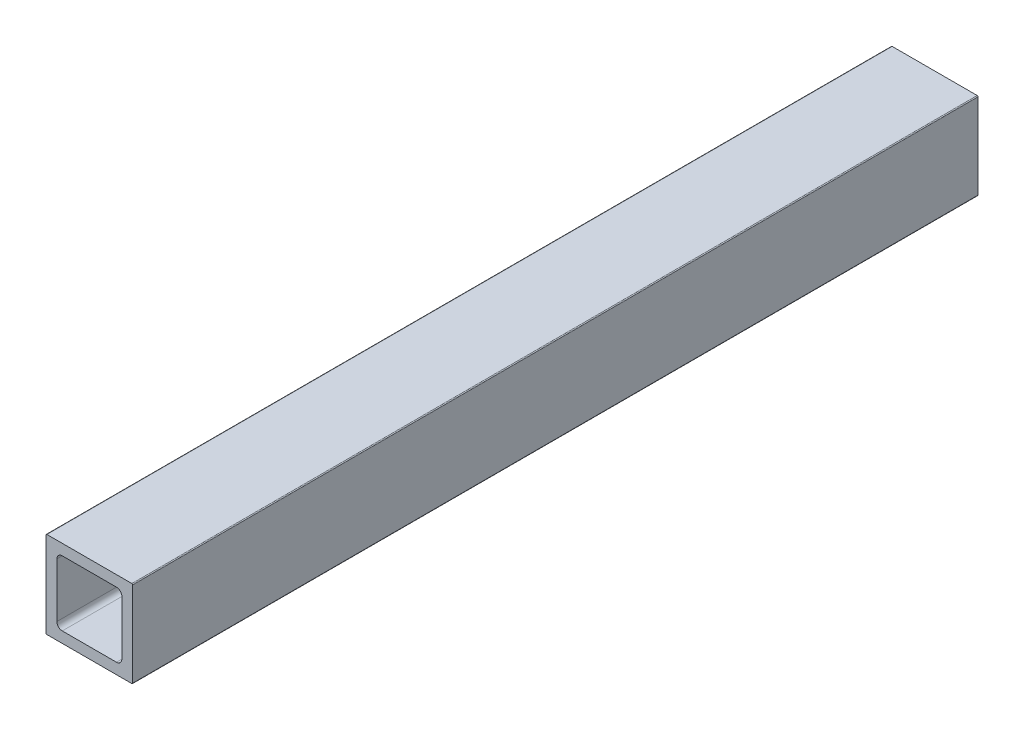
ISO-10303-21;
HEADER;
FILE_DESCRIPTION(('STEP AP214'),'2;1');
FILE_NAME('part.step','',(''),(''),'','','');
FILE_SCHEMA(('AUTOMOTIVE_DESIGN { 1 0 10303 214 1 1 1 1 }'));
ENDSEC;
DATA;
#1=APPLICATION_CONTEXT('core data for automotive mechanical design processes');
#2=APPLICATION_PROTOCOL_DEFINITION('international standard','automotive_design',2000,#1);
#3=PRODUCT_CONTEXT('',#1,'mechanical');
#4=PRODUCT('Part','Part','',(#3));
#5=PRODUCT_RELATED_PRODUCT_CATEGORY('part','',(#4));
#6=PRODUCT_DEFINITION_FORMATION('','',#4);
#7=PRODUCT_DEFINITION_CONTEXT('part definition',#1,'design');
#8=PRODUCT_DEFINITION('design','',#6,#7);
#9=PRODUCT_DEFINITION_SHAPE('','',#8);
#10=(LENGTH_UNIT() NAMED_UNIT(*) SI_UNIT(.MILLI.,.METRE.));
#11=(NAMED_UNIT(*) PLANE_ANGLE_UNIT() SI_UNIT($,.RADIAN.));
#12=(NAMED_UNIT(*) SI_UNIT($,.STERADIAN.) SOLID_ANGLE_UNIT());
#13=UNCERTAINTY_MEASURE_WITH_UNIT(LENGTH_MEASURE(1.E-05),#10,'distance_accuracy_value','');
#14=(GEOMETRIC_REPRESENTATION_CONTEXT(3) GLOBAL_UNCERTAINTY_ASSIGNED_CONTEXT((#13)) GLOBAL_UNIT_ASSIGNED_CONTEXT((#10,
#11,#12)) REPRESENTATION_CONTEXT('',''));
#15=CARTESIAN_POINT('',(0.,0.,0.));
#16=DIRECTION('',(0.,0.,1.));
#17=DIRECTION('',(1.,0.,0.));
#18=AXIS2_PLACEMENT_3D('',#15,#16,#17);
#19=CARTESIAN_POINT('',(0.254,0.254,0.));
#20=DIRECTION('',(0.,0.,-1.));
#21=DIRECTION('',(0.,-1.,0.));
#22=AXIS2_PLACEMENT_3D('',#19,#20,#21);
#23=PLANE('',#22);
#24=CARTESIAN_POINT('',(0.254,0.254,0.));
#25=DIRECTION('',(0.,0.,1.));
#26=DIRECTION('',(-1.,0.,0.));
#27=AXIS2_PLACEMENT_3D('',#24,#25,#26);
#28=CIRCLE('',#27,0.254);
#29=CARTESIAN_POINT('',(0.,0.254,0.));
#30=VERTEX_POINT('',#29);
#31=CARTESIAN_POINT('',(0.254,0.,0.));
#32=VERTEX_POINT('',#31);
#33=EDGE_CURVE('E204',#30,#32,#28,.T.);
#34=ORIENTED_EDGE('',*,*,#33,.F.);
#35=DIRECTION('',(0.,-1.,0.));
#36=VECTOR('',#35,1.);
#37=CARTESIAN_POINT('',(0.,0.254,0.));
#38=LINE('',#37,#36);
#39=CARTESIAN_POINT('',(0.,25.146,0.));
#40=VERTEX_POINT('',#39);
#41=EDGE_CURVE('E201',#40,#30,#38,.T.);
#42=ORIENTED_EDGE('',*,*,#41,.F.);
#43=CARTESIAN_POINT('',(0.254,25.146,0.));
#44=DIRECTION('',(0.,0.,1.));
#45=DIRECTION('',(-1.,0.,0.));
#46=AXIS2_PLACEMENT_3D('',#43,#44,#45);
#47=CIRCLE('',#46,0.254);
#48=CARTESIAN_POINT('',(0.254,25.4,0.));
#49=VERTEX_POINT('',#48);
#50=EDGE_CURVE('E226',#49,#40,#47,.T.);
#51=ORIENTED_EDGE('',*,*,#50,.F.);
#52=DIRECTION('',(-1.,0.,0.));
#53=VECTOR('',#52,1.);
#54=CARTESIAN_POINT('',(0.254,25.4,0.));
#55=LINE('',#54,#53);
#56=CARTESIAN_POINT('',(25.146,25.4,0.));
#57=VERTEX_POINT('',#56);
#58=EDGE_CURVE('E216',#57,#49,#55,.T.);
#59=ORIENTED_EDGE('',*,*,#58,.F.);
#60=CARTESIAN_POINT('',(25.146,25.146,0.));
#61=DIRECTION('',(0.,0.,1.));
#62=DIRECTION('',(-1.,0.,0.));
#63=AXIS2_PLACEMENT_3D('',#60,#61,#62);
#64=CIRCLE('',#63,0.254);
#65=CARTESIAN_POINT('',(25.4,25.146,0.));
#66=VERTEX_POINT('',#65);
#67=EDGE_CURVE('E252',#66,#57,#64,.T.);
#68=ORIENTED_EDGE('',*,*,#67,.F.);
#69=DIRECTION('',(0.,1.,0.));
#70=VECTOR('',#69,1.);
#71=CARTESIAN_POINT('',(25.4,0.254,0.));
#72=LINE('',#71,#70);
#73=CARTESIAN_POINT('',(25.4,0.254,0.));
#74=VERTEX_POINT('',#73);
#75=EDGE_CURVE('E251',#74,#66,#72,.T.);
#76=ORIENTED_EDGE('',*,*,#75,.F.);
#77=CARTESIAN_POINT('',(25.146,0.254,0.));
#78=DIRECTION('',(0.,0.,1.));
#79=DIRECTION('',(1.,0.,0.));
#80=AXIS2_PLACEMENT_3D('',#77,#78,#79);
#81=CIRCLE('',#80,0.254);
#82=CARTESIAN_POINT('',(25.146,0.,0.));
#83=VERTEX_POINT('',#82);
#84=EDGE_CURVE('E218',#83,#74,#81,.T.);
#85=ORIENTED_EDGE('',*,*,#84,.F.);
#86=DIRECTION('',(1.,0.,0.));
#87=VECTOR('',#86,1.);
#88=CARTESIAN_POINT('',(0.254,0.,0.));
#89=LINE('',#88,#87);
#90=EDGE_CURVE('E205',#32,#83,#89,.T.);
#91=ORIENTED_EDGE('',*,*,#90,.F.);
#92=EDGE_LOOP('',(#34,#42,#51,#59,#68,#76,#85,#91));
#93=FACE_BOUND('',#92,.T.);
#94=DIRECTION('',(0.,-1.,0.));
#95=VECTOR('',#94,1.);
#96=CARTESIAN_POINT('',(3.175,4.7625,0.));
#97=LINE('',#96,#95);
#98=CARTESIAN_POINT('',(3.175,20.6375,0.));
#99=VERTEX_POINT('',#98);
#100=CARTESIAN_POINT('',(3.175,4.7625,0.));
#101=VERTEX_POINT('',#100);
#102=EDGE_CURVE('E60',#99,#101,#97,.T.);
#103=ORIENTED_EDGE('',*,*,#102,.T.);
#104=CARTESIAN_POINT('',(4.7625,4.7625,0.));
#105=DIRECTION('',(0.,0.,1.));
#106=DIRECTION('',(1.,0.,0.));
#107=AXIS2_PLACEMENT_3D('',#104,#105,#106);
#108=CIRCLE('',#107,1.5875);
#109=CARTESIAN_POINT('',(4.7625,3.175,0.));
#110=VERTEX_POINT('',#109);
#111=EDGE_CURVE('E290',#101,#110,#108,.T.);
#112=ORIENTED_EDGE('',*,*,#111,.T.);
#113=DIRECTION('',(1.,0.,0.));
#114=VECTOR('',#113,1.);
#115=CARTESIAN_POINT('',(4.7625,3.175,0.));
#116=LINE('',#115,#114);
#117=CARTESIAN_POINT('',(20.6375,3.175,0.));
#118=VERTEX_POINT('',#117);
#119=EDGE_CURVE('E269',#110,#118,#116,.T.);
#120=ORIENTED_EDGE('',*,*,#119,.T.);
#121=CARTESIAN_POINT('',(20.6375,4.7625,0.));
#122=DIRECTION('',(0.,0.,1.));
#123=DIRECTION('',(-1.,0.,0.));
#124=AXIS2_PLACEMENT_3D('',#121,#122,#123);
#125=CIRCLE('',#124,1.5875);
#126=CARTESIAN_POINT('',(22.225,4.7625,0.));
#127=VERTEX_POINT('',#126);
#128=EDGE_CURVE('E238',#118,#127,#125,.T.);
#129=ORIENTED_EDGE('',*,*,#128,.T.);
#130=DIRECTION('',(0.,1.,0.));
#131=VECTOR('',#130,1.);
#132=CARTESIAN_POINT('',(22.225,4.7625,0.));
#133=LINE('',#132,#131);
#134=CARTESIAN_POINT('',(22.225,20.6375,0.));
#135=VERTEX_POINT('',#134);
#136=EDGE_CURVE('E234',#127,#135,#133,.T.);
#137=ORIENTED_EDGE('',*,*,#136,.T.);
#138=CARTESIAN_POINT('',(20.6375,20.6375,0.));
#139=DIRECTION('',(0.,0.,1.));
#140=DIRECTION('',(-1.,0.,0.));
#141=AXIS2_PLACEMENT_3D('',#138,#139,#140);
#142=CIRCLE('',#141,1.5875);
#143=CARTESIAN_POINT('',(20.6375,22.225,0.));
#144=VERTEX_POINT('',#143);
#145=EDGE_CURVE('E239',#135,#144,#142,.T.);
#146=ORIENTED_EDGE('',*,*,#145,.T.);
#147=DIRECTION('',(-1.,0.,0.));
#148=VECTOR('',#147,1.);
#149=CARTESIAN_POINT('',(4.7625,22.225,0.));
#150=LINE('',#149,#148);
#151=CARTESIAN_POINT('',(4.7625,22.225,0.));
#152=VERTEX_POINT('',#151);
#153=EDGE_CURVE('E244',#144,#152,#150,.T.);
#154=ORIENTED_EDGE('',*,*,#153,.T.);
#155=CARTESIAN_POINT('',(4.7625,20.6375,0.));
#156=DIRECTION('',(0.,0.,1.));
#157=DIRECTION('',(-1.,0.,0.));
#158=AXIS2_PLACEMENT_3D('',#155,#156,#157);
#159=CIRCLE('',#158,1.5875);
#160=EDGE_CURVE('E210',#152,#99,#159,.T.);
#161=ORIENTED_EDGE('',*,*,#160,.T.);
#162=EDGE_LOOP('',(#103,#112,#120,#129,#137,#146,#154,#161));
#163=FACE_BOUND('',#162,.T.);
#164=ADVANCED_FACE('F51',(#93,#163),#23,.T.);
#165=CARTESIAN_POINT('',(0.254,0.254,1828.8));
#166=DIRECTION('',(0.,0.,-1.));
#167=DIRECTION('',(-1.,0.,0.));
#168=AXIS2_PLACEMENT_3D('',#165,#166,#167);
#169=CYLINDRICAL_SURFACE('',#168,0.254);
#170=CARTESIAN_POINT('',(0.254,0.254,247.65));
#171=DIRECTION('',(0.,0.,-1.));
#172=DIRECTION('',(-1.,0.,0.));
#173=AXIS2_PLACEMENT_3D('',#170,#171,#172);
#174=CIRCLE('',#173,0.254);
#175=CARTESIAN_POINT('',(0.,0.254,247.65));
#176=VERTEX_POINT('',#175);
#177=CARTESIAN_POINT('',(0.254,0.,247.65));
#178=VERTEX_POINT('',#177);
#179=EDGE_CURVE('E180',#176,#178,#174,.F.);
#180=ORIENTED_EDGE('',*,*,#179,.F.);
#181=DIRECTION('',(0.,0.,-1.));
#182=VECTOR('',#181,1.);
#183=CARTESIAN_POINT('',(0.,0.254,1828.8));
#184=LINE('',#183,#182);
#185=EDGE_CURVE('E192',#176,#30,#184,.T.);
#186=ORIENTED_EDGE('',*,*,#185,.T.);
#187=ORIENTED_EDGE('',*,*,#33,.T.);
#188=DIRECTION('',(0.,0.,-1.));
#189=VECTOR('',#188,1.);
#190=CARTESIAN_POINT('',(0.254,0.,1828.8));
#191=LINE('',#190,#189);
#192=EDGE_CURVE('E194',#178,#32,#191,.T.);
#193=ORIENTED_EDGE('',*,*,#192,.F.);
#194=EDGE_LOOP('',(#180,#186,#187,#193));
#195=FACE_BOUND('',#194,.T.);
#196=ADVANCED_FACE('F190',(#195),#169,.T.);
#197=CARTESIAN_POINT('',(0.254,0.,1828.8));
#198=DIRECTION('',(0.,1.,0.));
#199=DIRECTION('',(1.,0.,0.));
#200=AXIS2_PLACEMENT_3D('',#197,#198,#199);
#201=PLANE('',#200);
#202=DIRECTION('',(0.,0.,-1.));
#203=VECTOR('',#202,1.);
#204=CARTESIAN_POINT('',(25.146,0.,1828.8));
#205=LINE('',#204,#203);
#206=CARTESIAN_POINT('',(25.146,0.,247.65));
#207=VERTEX_POINT('',#206);
#208=EDGE_CURVE('E222',#207,#83,#205,.T.);
#209=ORIENTED_EDGE('',*,*,#208,.F.);
#210=DIRECTION('',(1.,0.,0.));
#211=VECTOR('',#210,1.);
#212=CARTESIAN_POINT('',(0.,0.,247.65));
#213=LINE('',#212,#211);
#214=EDGE_CURVE('E186',#178,#207,#213,.T.);
#215=ORIENTED_EDGE('',*,*,#214,.F.);
#216=ORIENTED_EDGE('',*,*,#192,.T.);
#217=ORIENTED_EDGE('',*,*,#90,.T.);
#218=EDGE_LOOP('',(#209,#215,#216,#217));
#219=FACE_BOUND('',#218,.T.);
#220=ADVANCED_FACE('F406',(#219),#201,.F.);
#221=CARTESIAN_POINT('',(25.146,0.254,1828.8));
#222=DIRECTION('',(0.,0.,-1.));
#223=DIRECTION('',(-1.,0.,0.));
#224=AXIS2_PLACEMENT_3D('',#221,#222,#223);
#225=CYLINDRICAL_SURFACE('',#224,0.254);
#226=CARTESIAN_POINT('',(25.146,0.254,247.65));
#227=DIRECTION('',(0.,0.,-1.));
#228=DIRECTION('',(-1.,0.,0.));
#229=AXIS2_PLACEMENT_3D('',#226,#227,#228);
#230=CIRCLE('',#229,0.254);
#231=CARTESIAN_POINT('',(25.4,0.254,247.65));
#232=VERTEX_POINT('',#231);
#233=EDGE_CURVE('E197',#207,#232,#230,.F.);
#234=ORIENTED_EDGE('',*,*,#233,.F.);
#235=ORIENTED_EDGE('',*,*,#208,.T.);
#236=ORIENTED_EDGE('',*,*,#84,.T.);
#237=DIRECTION('',(0.,0.,-1.));
#238=VECTOR('',#237,1.);
#239=CARTESIAN_POINT('',(25.4,0.254,1828.8));
#240=LINE('',#239,#238);
#241=EDGE_CURVE('E248',#232,#74,#240,.T.);
#242=ORIENTED_EDGE('',*,*,#241,.F.);
#243=EDGE_LOOP('',(#234,#235,#236,#242));
#244=FACE_BOUND('',#243,.T.);
#245=ADVANCED_FACE('F403',(#244),#225,.T.);
#246=CARTESIAN_POINT('',(25.4,0.254,1828.8));
#247=DIRECTION('',(-1.,0.,0.));
#248=DIRECTION('',(0.,0.,1.));
#249=AXIS2_PLACEMENT_3D('',#246,#247,#248);
#250=PLANE('',#249);
#251=DIRECTION('',(0.,0.,-1.));
#252=VECTOR('',#251,1.);
#253=CARTESIAN_POINT('',(25.4,25.146,1828.8));
#254=LINE('',#253,#252);
#255=CARTESIAN_POINT('',(25.4,25.146,247.65));
#256=VERTEX_POINT('',#255);
#257=EDGE_CURVE('E280',#256,#66,#254,.T.);
#258=ORIENTED_EDGE('',*,*,#257,.F.);
#259=DIRECTION('',(0.,1.,0.));
#260=VECTOR('',#259,1.);
#261=CARTESIAN_POINT('',(25.4,0.,247.65));
#262=LINE('',#261,#260);
#263=EDGE_CURVE('E361',#232,#256,#262,.T.);
#264=ORIENTED_EDGE('',*,*,#263,.F.);
#265=ORIENTED_EDGE('',*,*,#241,.T.);
#266=ORIENTED_EDGE('',*,*,#75,.T.);
#267=EDGE_LOOP('',(#258,#264,#265,#266));
#268=FACE_BOUND('',#267,.T.);
#269=ADVANCED_FACE('F398',(#268),#250,.F.);
#270=CARTESIAN_POINT('',(25.146,25.146,1828.8));
#271=DIRECTION('',(0.,0.,-1.));
#272=DIRECTION('',(-1.,0.,0.));
#273=AXIS2_PLACEMENT_3D('',#270,#271,#272);
#274=CYLINDRICAL_SURFACE('',#273,0.254);
#275=CARTESIAN_POINT('',(25.146,25.146,247.65));
#276=DIRECTION('',(0.,0.,-1.));
#277=DIRECTION('',(-1.,0.,0.));
#278=AXIS2_PLACEMENT_3D('',#275,#276,#277);
#279=CIRCLE('',#278,0.254);
#280=CARTESIAN_POINT('',(25.146,25.4,247.65));
#281=VERTEX_POINT('',#280);
#282=EDGE_CURVE('E330',#256,#281,#279,.F.);
#283=ORIENTED_EDGE('',*,*,#282,.F.);
#284=ORIENTED_EDGE('',*,*,#257,.T.);
#285=ORIENTED_EDGE('',*,*,#67,.T.);
#286=DIRECTION('',(0.,0.,-1.));
#287=VECTOR('',#286,1.);
#288=CARTESIAN_POINT('',(25.146,25.4,1828.8));
#289=LINE('',#288,#287);
#290=EDGE_CURVE('E242',#281,#57,#289,.T.);
#291=ORIENTED_EDGE('',*,*,#290,.F.);
#292=EDGE_LOOP('',(#283,#284,#285,#291));
#293=FACE_BOUND('',#292,.T.);
#294=ADVANCED_FACE('F53',(#293),#274,.T.);
#295=CARTESIAN_POINT('',(0.254,25.4,1828.8));
#296=DIRECTION('',(0.,-1.,0.));
#297=DIRECTION('',(0.,0.,-1.));
#298=AXIS2_PLACEMENT_3D('',#295,#296,#297);
#299=PLANE('',#298);
#300=DIRECTION('',(0.,0.,-1.));
#301=VECTOR('',#300,1.);
#302=CARTESIAN_POINT('',(0.254,25.4,1828.8));
#303=LINE('',#302,#301);
#304=CARTESIAN_POINT('',(0.254,25.4,247.65));
#305=VERTEX_POINT('',#304);
#306=EDGE_CURVE('E223',#305,#49,#303,.T.);
#307=ORIENTED_EDGE('',*,*,#306,.F.);
#308=DIRECTION('',(-1.,0.,0.));
#309=VECTOR('',#308,1.);
#310=CARTESIAN_POINT('',(0.,25.4,247.65));
#311=LINE('',#310,#309);
#312=EDGE_CURVE('E358',#281,#305,#311,.T.);
#313=ORIENTED_EDGE('',*,*,#312,.F.);
#314=ORIENTED_EDGE('',*,*,#290,.T.);
#315=ORIENTED_EDGE('',*,*,#58,.T.);
#316=EDGE_LOOP('',(#307,#313,#314,#315));
#317=FACE_BOUND('',#316,.T.);
#318=ADVANCED_FACE('F389',(#317),#299,.F.);
#319=CARTESIAN_POINT('',(0.254,25.146,1828.8));
#320=DIRECTION('',(0.,0.,-1.));
#321=DIRECTION('',(-1.,0.,0.));
#322=AXIS2_PLACEMENT_3D('',#319,#320,#321);
#323=CYLINDRICAL_SURFACE('',#322,0.254);
#324=CARTESIAN_POINT('',(0.254,25.146,247.65));
#325=DIRECTION('',(0.,0.,-1.));
#326=DIRECTION('',(-1.,0.,0.));
#327=AXIS2_PLACEMENT_3D('',#324,#325,#326);
#328=CIRCLE('',#327,0.254);
#329=CARTESIAN_POINT('',(0.,25.146,247.65));
#330=VERTEX_POINT('',#329);
#331=EDGE_CURVE('E67',#305,#330,#328,.F.);
#332=ORIENTED_EDGE('',*,*,#331,.F.);
#333=ORIENTED_EDGE('',*,*,#306,.T.);
#334=ORIENTED_EDGE('',*,*,#50,.T.);
#335=DIRECTION('',(0.,0.,-1.));
#336=VECTOR('',#335,1.);
#337=CARTESIAN_POINT('',(0.,25.146,1828.8));
#338=LINE('',#337,#336);
#339=EDGE_CURVE('E230',#330,#40,#338,.T.);
#340=ORIENTED_EDGE('',*,*,#339,.F.);
#341=EDGE_LOOP('',(#332,#333,#334,#340));
#342=FACE_BOUND('',#341,.T.);
#343=ADVANCED_FACE('F408',(#342),#323,.T.);
#344=CARTESIAN_POINT('',(0.,0.254,1828.8));
#345=DIRECTION('',(1.,0.,0.));
#346=DIRECTION('',(0.,1.,0.));
#347=AXIS2_PLACEMENT_3D('',#344,#345,#346);
#348=PLANE('',#347);
#349=ORIENTED_EDGE('',*,*,#185,.F.);
#350=DIRECTION('',(0.,-1.,0.));
#351=VECTOR('',#350,1.);
#352=CARTESIAN_POINT('',(0.,0.,247.65));
#353=LINE('',#352,#351);
#354=EDGE_CURVE('E177',#330,#176,#353,.T.);
#355=ORIENTED_EDGE('',*,*,#354,.F.);
#356=ORIENTED_EDGE('',*,*,#339,.T.);
#357=ORIENTED_EDGE('',*,*,#41,.T.);
#358=EDGE_LOOP('',(#349,#355,#356,#357));
#359=FACE_BOUND('',#358,.T.);
#360=ADVANCED_FACE('F199',(#359),#348,.F.);
#361=CARTESIAN_POINT('',(4.7625,4.7625,1828.8));
#362=DIRECTION('',(0.,0.,-1.));
#363=DIRECTION('',(-1.,0.,0.));
#364=AXIS2_PLACEMENT_3D('',#361,#362,#363);
#365=CYLINDRICAL_SURFACE('',#364,1.5875);
#366=DIRECTION('',(0.,0.,-1.));
#367=VECTOR('',#366,1.);
#368=CARTESIAN_POINT('',(3.175,4.7625,1828.8));
#369=LINE('',#368,#367);
#370=CARTESIAN_POINT('',(3.175,4.7625,247.65));
#371=VERTEX_POINT('',#370);
#372=EDGE_CURVE('E196',#371,#101,#369,.T.);
#373=ORIENTED_EDGE('',*,*,#372,.F.);
#374=CARTESIAN_POINT('',(4.7625,4.7625,247.65));
#375=DIRECTION('',(0.,0.,-1.));
#376=DIRECTION('',(-1.,0.,0.));
#377=AXIS2_PLACEMENT_3D('',#374,#375,#376);
#378=CIRCLE('',#377,1.5875);
#379=CARTESIAN_POINT('',(4.7625,3.175,247.65));
#380=VERTEX_POINT('',#379);
#381=EDGE_CURVE('E74',#371,#380,#378,.F.);
#382=ORIENTED_EDGE('',*,*,#381,.T.);
#383=DIRECTION('',(0.,0.,-1.));
#384=VECTOR('',#383,1.);
#385=CARTESIAN_POINT('',(4.7625,3.175,1828.8));
#386=LINE('',#385,#384);
#387=EDGE_CURVE('E227',#380,#110,#386,.T.);
#388=ORIENTED_EDGE('',*,*,#387,.T.);
#389=ORIENTED_EDGE('',*,*,#111,.F.);
#390=EDGE_LOOP('',(#373,#382,#388,#389));
#391=FACE_BOUND('',#390,.T.);
#392=ADVANCED_FACE('F415',(#391),#365,.F.);
#393=CARTESIAN_POINT('',(4.7625,3.175,1828.8));
#394=DIRECTION('',(0.,1.,0.));
#395=DIRECTION('',(1.,0.,0.));
#396=AXIS2_PLACEMENT_3D('',#393,#394,#395);
#397=PLANE('',#396);
#398=DIRECTION('',(-1.,0.,0.));
#399=VECTOR('',#398,1.);
#400=CARTESIAN_POINT('',(4.7625,3.175,247.65));
#401=LINE('',#400,#399);
#402=CARTESIAN_POINT('',(20.6375,3.175,247.65));
#403=VERTEX_POINT('',#402);
#404=EDGE_CURVE('E337',#403,#380,#401,.T.);
#405=ORIENTED_EDGE('',*,*,#404,.F.);
#406=DIRECTION('',(0.,0.,-1.));
#407=VECTOR('',#406,1.);
#408=CARTESIAN_POINT('',(20.6375,3.175,1828.8));
#409=LINE('',#408,#407);
#410=EDGE_CURVE('E231',#403,#118,#409,.T.);
#411=ORIENTED_EDGE('',*,*,#410,.T.);
#412=ORIENTED_EDGE('',*,*,#119,.F.);
#413=ORIENTED_EDGE('',*,*,#387,.F.);
#414=EDGE_LOOP('',(#405,#411,#412,#413));
#415=FACE_BOUND('',#414,.T.);
#416=ADVANCED_FACE('F438',(#415),#397,.T.);
#417=CARTESIAN_POINT('',(20.6375,4.7625,1828.8));
#418=DIRECTION('',(0.,0.,-1.));
#419=DIRECTION('',(-1.,0.,0.));
#420=AXIS2_PLACEMENT_3D('',#417,#418,#419);
#421=CYLINDRICAL_SURFACE('',#420,1.5875);
#422=ORIENTED_EDGE('',*,*,#410,.F.);
#423=CARTESIAN_POINT('',(20.6375,4.7625,247.65));
#424=DIRECTION('',(0.,0.,-1.));
#425=DIRECTION('',(-1.,0.,0.));
#426=AXIS2_PLACEMENT_3D('',#423,#424,#425);
#427=CIRCLE('',#426,1.5875);
#428=CARTESIAN_POINT('',(22.225,4.7625,247.65));
#429=VERTEX_POINT('',#428);
#430=EDGE_CURVE('E340',#403,#429,#427,.F.);
#431=ORIENTED_EDGE('',*,*,#430,.T.);
#432=DIRECTION('',(0.,0.,-1.));
#433=VECTOR('',#432,1.);
#434=CARTESIAN_POINT('',(22.225,4.7625,1828.8));
#435=LINE('',#434,#433);
#436=EDGE_CURVE('E276',#429,#127,#435,.T.);
#437=ORIENTED_EDGE('',*,*,#436,.T.);
#438=ORIENTED_EDGE('',*,*,#128,.F.);
#439=EDGE_LOOP('',(#422,#431,#437,#438));
#440=FACE_BOUND('',#439,.T.);
#441=ADVANCED_FACE('F440',(#440),#421,.F.);
#442=CARTESIAN_POINT('',(22.225,4.7625,1828.8));
#443=DIRECTION('',(-1.,0.,0.));
#444=DIRECTION('',(0.,0.,1.));
#445=AXIS2_PLACEMENT_3D('',#442,#443,#444);
#446=PLANE('',#445);
#447=DIRECTION('',(0.,-1.,0.));
#448=VECTOR('',#447,1.);
#449=CARTESIAN_POINT('',(22.225,4.7625,247.65));
#450=LINE('',#449,#448);
#451=CARTESIAN_POINT('',(22.225,20.6375,247.65));
#452=VERTEX_POINT('',#451);
#453=EDGE_CURVE('E344',#452,#429,#450,.T.);
#454=ORIENTED_EDGE('',*,*,#453,.F.);
#455=DIRECTION('',(0.,0.,-1.));
#456=VECTOR('',#455,1.);
#457=CARTESIAN_POINT('',(22.225,20.6375,1828.8));
#458=LINE('',#457,#456);
#459=EDGE_CURVE('E258',#452,#135,#458,.T.);
#460=ORIENTED_EDGE('',*,*,#459,.T.);
#461=ORIENTED_EDGE('',*,*,#136,.F.);
#462=ORIENTED_EDGE('',*,*,#436,.F.);
#463=EDGE_LOOP('',(#454,#460,#461,#462));
#464=FACE_BOUND('',#463,.T.);
#465=ADVANCED_FACE('F448',(#464),#446,.T.);
#466=CARTESIAN_POINT('',(20.6375,20.6375,1828.8));
#467=DIRECTION('',(0.,0.,-1.));
#468=DIRECTION('',(-1.,0.,0.));
#469=AXIS2_PLACEMENT_3D('',#466,#467,#468);
#470=CYLINDRICAL_SURFACE('',#469,1.5875);
#471=ORIENTED_EDGE('',*,*,#459,.F.);
#472=CARTESIAN_POINT('',(20.6375,20.6375,247.65));
#473=DIRECTION('',(0.,0.,-1.));
#474=DIRECTION('',(-1.,0.,0.));
#475=AXIS2_PLACEMENT_3D('',#472,#473,#474);
#476=CIRCLE('',#475,1.5875);
#477=CARTESIAN_POINT('',(20.6375,22.225,247.65));
#478=VERTEX_POINT('',#477);
#479=EDGE_CURVE('E347',#452,#478,#476,.F.);
#480=ORIENTED_EDGE('',*,*,#479,.T.);
#481=DIRECTION('',(0.,0.,-1.));
#482=VECTOR('',#481,1.);
#483=CARTESIAN_POINT('',(20.6375,22.225,1828.8));
#484=LINE('',#483,#482);
#485=EDGE_CURVE('E255',#478,#144,#484,.T.);
#486=ORIENTED_EDGE('',*,*,#485,.T.);
#487=ORIENTED_EDGE('',*,*,#145,.F.);
#488=EDGE_LOOP('',(#471,#480,#486,#487));
#489=FACE_BOUND('',#488,.T.);
#490=ADVANCED_FACE('F443',(#489),#470,.F.);
#491=CARTESIAN_POINT('',(4.7625,22.225,1828.8));
#492=DIRECTION('',(0.,-1.,0.));
#493=DIRECTION('',(0.,0.,-1.));
#494=AXIS2_PLACEMENT_3D('',#491,#492,#493);
#495=PLANE('',#494);
#496=DIRECTION('',(1.,0.,0.));
#497=VECTOR('',#496,1.);
#498=CARTESIAN_POINT('',(4.7625,22.225,247.65));
#499=LINE('',#498,#497);
#500=CARTESIAN_POINT('',(4.7625,22.225,247.65));
#501=VERTEX_POINT('',#500);
#502=EDGE_CURVE('E351',#501,#478,#499,.T.);
#503=ORIENTED_EDGE('',*,*,#502,.F.);
#504=DIRECTION('',(0.,0.,-1.));
#505=VECTOR('',#504,1.);
#506=CARTESIAN_POINT('',(4.7625,22.225,1828.8));
#507=LINE('',#506,#505);
#508=EDGE_CURVE('E259',#501,#152,#507,.T.);
#509=ORIENTED_EDGE('',*,*,#508,.T.);
#510=ORIENTED_EDGE('',*,*,#153,.F.);
#511=ORIENTED_EDGE('',*,*,#485,.F.);
#512=EDGE_LOOP('',(#503,#509,#510,#511));
#513=FACE_BOUND('',#512,.T.);
#514=ADVANCED_FACE('F433',(#513),#495,.T.);
#515=CARTESIAN_POINT('',(4.7625,20.6375,1828.8));
#516=DIRECTION('',(0.,0.,-1.));
#517=DIRECTION('',(-1.,0.,0.));
#518=AXIS2_PLACEMENT_3D('',#515,#516,#517);
#519=CYLINDRICAL_SURFACE('',#518,1.5875);
#520=ORIENTED_EDGE('',*,*,#508,.F.);
#521=CARTESIAN_POINT('',(4.7625,20.6375,247.65));
#522=DIRECTION('',(0.,0.,-1.));
#523=DIRECTION('',(-1.,0.,0.));
#524=AXIS2_PLACEMENT_3D('',#521,#522,#523);
#525=CIRCLE('',#524,1.5875);
#526=CARTESIAN_POINT('',(3.175,20.6375,247.65));
#527=VERTEX_POINT('',#526);
#528=EDGE_CURVE('E354',#501,#527,#525,.F.);
#529=ORIENTED_EDGE('',*,*,#528,.T.);
#530=DIRECTION('',(0.,0.,-1.));
#531=VECTOR('',#530,1.);
#532=CARTESIAN_POINT('',(3.175,20.6375,1828.8));
#533=LINE('',#532,#531);
#534=EDGE_CURVE('E263',#527,#99,#533,.T.);
#535=ORIENTED_EDGE('',*,*,#534,.T.);
#536=ORIENTED_EDGE('',*,*,#160,.F.);
#537=EDGE_LOOP('',(#520,#529,#535,#536));
#538=FACE_BOUND('',#537,.T.);
#539=ADVANCED_FACE('F429',(#538),#519,.F.);
#540=CARTESIAN_POINT('',(3.175,4.7625,1828.8));
#541=DIRECTION('',(1.,0.,0.));
#542=DIRECTION('',(0.,1.,0.));
#543=AXIS2_PLACEMENT_3D('',#540,#541,#542);
#544=PLANE('',#543);
#545=DIRECTION('',(0.,1.,0.));
#546=VECTOR('',#545,1.);
#547=CARTESIAN_POINT('',(3.175,4.7625,247.65));
#548=LINE('',#547,#546);
#549=EDGE_CURVE('E11',#371,#527,#548,.T.);
#550=ORIENTED_EDGE('',*,*,#549,.F.);
#551=ORIENTED_EDGE('',*,*,#372,.T.);
#552=ORIENTED_EDGE('',*,*,#102,.F.);
#553=ORIENTED_EDGE('',*,*,#534,.F.);
#554=EDGE_LOOP('',(#550,#551,#552,#553));
#555=FACE_BOUND('',#554,.T.);
#556=ADVANCED_FACE('F432',(#555),#544,.T.);
#557=CARTESIAN_POINT('',(0.,0.,247.65));
#558=DIRECTION('',(0.,0.,-1.));
#559=DIRECTION('',(-1.,0.,0.));
#560=AXIS2_PLACEMENT_3D('',#557,#558,#559);
#561=PLANE('',#560);
#562=ORIENTED_EDGE('',*,*,#179,.T.);
#563=ORIENTED_EDGE('',*,*,#214,.T.);
#564=ORIENTED_EDGE('',*,*,#233,.T.);
#565=ORIENTED_EDGE('',*,*,#263,.T.);
#566=ORIENTED_EDGE('',*,*,#282,.T.);
#567=ORIENTED_EDGE('',*,*,#312,.T.);
#568=ORIENTED_EDGE('',*,*,#331,.T.);
#569=ORIENTED_EDGE('',*,*,#354,.T.);
#570=EDGE_LOOP('',(#562,#563,#564,#565,#566,#567,#568,#569));
#571=FACE_BOUND('',#570,.T.);
#572=ORIENTED_EDGE('',*,*,#549,.T.);
#573=ORIENTED_EDGE('',*,*,#528,.F.);
#574=ORIENTED_EDGE('',*,*,#502,.T.);
#575=ORIENTED_EDGE('',*,*,#479,.F.);
#576=ORIENTED_EDGE('',*,*,#453,.T.);
#577=ORIENTED_EDGE('',*,*,#430,.F.);
#578=ORIENTED_EDGE('',*,*,#404,.T.);
#579=ORIENTED_EDGE('',*,*,#381,.F.);
#580=EDGE_LOOP('',(#572,#573,#574,#575,#576,#577,#578,#579));
#581=FACE_BOUND('',#580,.T.);
#582=ADVANCED_FACE('F179',(#571,#581),#561,.F.);
#583=CLOSED_SHELL('',(#164,#196,#220,#245,#269,#294,#318,#343,#360,#392,#416,#441,#465,#490,
#514,#539,#556,#582));
#584=MANIFOLD_SOLID_BREP('B2',#583);
#585=ADVANCED_BREP_SHAPE_REPRESENTATION('',(#18,#584),#14);
#586=SHAPE_DEFINITION_REPRESENTATION(#9,#585);
ENDSEC;
END-ISO-10303-21;
